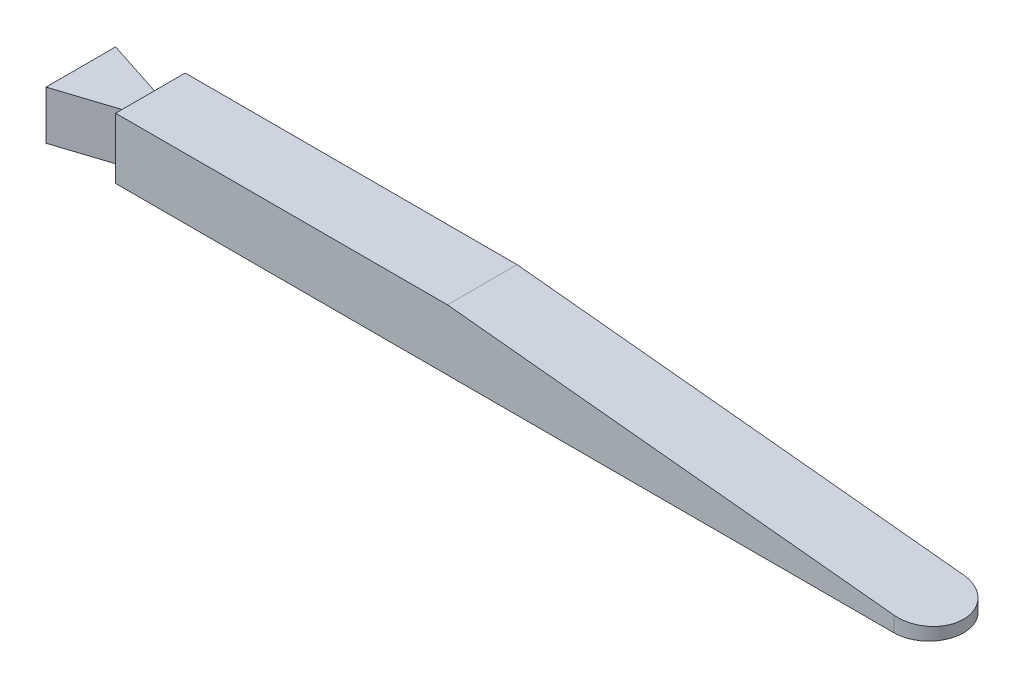
ISO-10303-21;
HEADER;
FILE_DESCRIPTION(('STEP AP214'),'2;1');
FILE_NAME('part.step','',(''),(''),'','','');
FILE_SCHEMA(('AUTOMOTIVE_DESIGN { 1 0 10303 214 1 1 1 1 }'));
ENDSEC;
DATA;
#1=APPLICATION_CONTEXT('core data for automotive mechanical design processes');
#2=APPLICATION_PROTOCOL_DEFINITION('international standard','automotive_design',2000,#1);
#3=PRODUCT_CONTEXT('',#1,'mechanical');
#4=PRODUCT('Part','Part','',(#3));
#5=PRODUCT_RELATED_PRODUCT_CATEGORY('part','',(#4));
#6=PRODUCT_DEFINITION_FORMATION('','',#4);
#7=PRODUCT_DEFINITION_CONTEXT('part definition',#1,'design');
#8=PRODUCT_DEFINITION('design','',#6,#7);
#9=PRODUCT_DEFINITION_SHAPE('','',#8);
#10=(LENGTH_UNIT() NAMED_UNIT(*) SI_UNIT(.MILLI.,.METRE.));
#11=(NAMED_UNIT(*) PLANE_ANGLE_UNIT() SI_UNIT($,.RADIAN.));
#12=(NAMED_UNIT(*) SI_UNIT($,.STERADIAN.) SOLID_ANGLE_UNIT());
#13=UNCERTAINTY_MEASURE_WITH_UNIT(LENGTH_MEASURE(1.E-05),#10,'distance_accuracy_value','');
#14=(GEOMETRIC_REPRESENTATION_CONTEXT(3) GLOBAL_UNCERTAINTY_ASSIGNED_CONTEXT((#13)) GLOBAL_UNIT_ASSIGNED_CONTEXT((#10,
#11,#12)) REPRESENTATION_CONTEXT('',''));
#15=CARTESIAN_POINT('',(0.,0.,0.));
#16=DIRECTION('',(0.,0.,1.));
#17=DIRECTION('',(1.,0.,0.));
#18=AXIS2_PLACEMENT_3D('',#15,#16,#17);
#19=CARTESIAN_POINT('',(-22.0395487991643,31.75,2.54000000000013));
#20=DIRECTION('',(-0.307897158123463,0.,0.951419644541511));
#21=DIRECTION('',(0.951419644541511,0.,0.307897158123463));
#22=AXIS2_PLACEMENT_3D('',#19,#20,#21);
#23=PLANE('',#22);
#24=DIRECTION('',(-0.951419644541511,0.,-0.307897158123463));
#25=VECTOR('',#24,1.);
#26=CARTESIAN_POINT('',(-22.0395487991643,25.4,2.54000000000014));
#27=LINE('',#26,#25);
#28=CARTESIAN_POINT('',(14.3002312008357,25.4,14.300231200843));
#29=VERTEX_POINT('',#28);
#30=CARTESIAN_POINT('',(-22.0395487991643,25.4,2.54000000000014));
#31=VERTEX_POINT('',#30);
#32=EDGE_CURVE('E221',#29,#31,#27,.T.);
#33=ORIENTED_EDGE('',*,*,#32,.F.);
#34=DIRECTION('',(0.,-1.,0.));
#35=VECTOR('',#34,1.);
#36=CARTESIAN_POINT('',(14.3002312008357,31.75,14.300231200843));
#37=LINE('',#36,#35);
#38=CARTESIAN_POINT('',(14.3002312008357,0.,14.300231200843));
#39=VERTEX_POINT('',#38);
#40=EDGE_CURVE('E12',#29,#39,#37,.T.);
#41=ORIENTED_EDGE('',*,*,#40,.T.);
#42=DIRECTION('',(-0.951419644541511,0.,-0.307897158123463));
#43=VECTOR('',#42,1.);
#44=CARTESIAN_POINT('',(-22.0395487991643,0.,2.54000000000013));
#45=LINE('',#44,#43);
#46=CARTESIAN_POINT('',(-22.0395487991643,0.,2.54000000000013));
#47=VERTEX_POINT('',#46);
#48=EDGE_CURVE('E126',#39,#47,#45,.T.);
#49=ORIENTED_EDGE('',*,*,#48,.T.);
#50=DIRECTION('',(0.,-1.,0.));
#51=VECTOR('',#50,1.);
#52=CARTESIAN_POINT('',(-22.0395487991643,31.75,2.54000000000013));
#53=LINE('',#52,#51);
#54=EDGE_CURVE('E55',#31,#47,#53,.T.);
#55=ORIENTED_EDGE('',*,*,#54,.F.);
#56=EDGE_LOOP('',(#33,#41,#49,#55));
#57=FACE_BOUND('',#56,.T.);
#58=ADVANCED_FACE('F47',(#57),#23,.F.);
#59=CARTESIAN_POINT('',(-22.0395487991643,31.75,2.54000000000013));
#60=DIRECTION('',(1.,0.,0.));
#61=DIRECTION('',(0.,0.,-1.));
#62=AXIS2_PLACEMENT_3D('',#59,#60,#61);
#63=PLANE('',#62);
#64=DIRECTION('',(0.,0.,1.));
#65=VECTOR('',#64,1.);
#66=CARTESIAN_POINT('',(-22.0395487991643,25.4,2.54000000000014));
#67=LINE('',#66,#65);
#68=CARTESIAN_POINT('',(-22.0395487991643,25.4,38.8797800000001));
#69=VERTEX_POINT('',#68);
#70=EDGE_CURVE('E179',#31,#69,#67,.T.);
#71=ORIENTED_EDGE('',*,*,#70,.F.);
#72=ORIENTED_EDGE('',*,*,#54,.T.);
#73=DIRECTION('',(0.,0.,1.));
#74=VECTOR('',#73,1.);
#75=CARTESIAN_POINT('',(-22.0395487991643,0.,2.54000000000013));
#76=LINE('',#75,#74);
#77=CARTESIAN_POINT('',(-22.0395487991643,0.,38.8797800000001));
#78=VERTEX_POINT('',#77);
#79=EDGE_CURVE('E132',#47,#78,#76,.T.);
#80=ORIENTED_EDGE('',*,*,#79,.T.);
#81=DIRECTION('',(0.,-1.,0.));
#82=VECTOR('',#81,1.);
#83=CARTESIAN_POINT('',(-22.0395487991643,31.75,38.8797800000001));
#84=LINE('',#83,#82);
#85=EDGE_CURVE('E168',#69,#78,#84,.T.);
#86=ORIENTED_EDGE('',*,*,#85,.F.);
#87=EDGE_LOOP('',(#71,#72,#80,#86));
#88=FACE_BOUND('',#87,.T.);
#89=ADVANCED_FACE('F174',(#88),#63,.F.);
#90=CARTESIAN_POINT('',(-22.0395487991643,31.75,38.8797800000001));
#91=DIRECTION('',(-0.307897158123464,0.,-0.951419644541511));
#92=DIRECTION('',(-0.951419644541511,0.,0.307897158123464));
#93=AXIS2_PLACEMENT_3D('',#90,#91,#92);
#94=PLANE('',#93);
#95=DIRECTION('',(0.951419644541511,0.,-0.307897158123464));
#96=VECTOR('',#95,1.);
#97=CARTESIAN_POINT('',(-22.0395487991643,25.4,38.8797800000001));
#98=LINE('',#97,#96);
#99=CARTESIAN_POINT('',(14.3002312008357,25.4,27.1195487991573));
#100=VERTEX_POINT('',#99);
#101=EDGE_CURVE('E191',#69,#100,#98,.T.);
#102=ORIENTED_EDGE('',*,*,#101,.F.);
#103=ORIENTED_EDGE('',*,*,#85,.T.);
#104=DIRECTION('',(0.951419644541511,0.,-0.307897158123464));
#105=VECTOR('',#104,1.);
#106=CARTESIAN_POINT('',(-22.0395487991643,0.,38.8797800000001));
#107=LINE('',#106,#105);
#108=CARTESIAN_POINT('',(14.3002312008357,0.,27.1195487991573));
#109=VERTEX_POINT('',#108);
#110=EDGE_CURVE('E143',#78,#109,#107,.T.);
#111=ORIENTED_EDGE('',*,*,#110,.T.);
#112=DIRECTION('',(0.,-1.,0.));
#113=VECTOR('',#112,1.);
#114=CARTESIAN_POINT('',(14.3002312008357,31.75,27.1195487991573));
#115=LINE('',#114,#113);
#116=EDGE_CURVE('E165',#100,#109,#115,.T.);
#117=ORIENTED_EDGE('',*,*,#116,.F.);
#118=EDGE_LOOP('',(#102,#103,#111,#117));
#119=FACE_BOUND('',#118,.T.);
#120=ADVANCED_FACE('F187',(#119),#94,.F.);
#121=CARTESIAN_POINT('',(14.3002312008357,31.75,27.1195487991573));
#122=DIRECTION('',(1.,0.,0.));
#123=DIRECTION('',(0.,0.,-1.));
#124=AXIS2_PLACEMENT_3D('',#121,#122,#123);
#125=PLANE('',#124);
#126=DIRECTION('',(0.,0.,1.));
#127=VECTOR('',#126,1.);
#128=CARTESIAN_POINT('',(14.3002312008357,0.,27.1195487991573));
#129=LINE('',#128,#127);
#130=CARTESIAN_POINT('',(14.3002312008357,0.,38.8797800000001));
#131=VERTEX_POINT('',#130);
#132=EDGE_CURVE('E147',#109,#131,#129,.T.);
#133=ORIENTED_EDGE('',*,*,#132,.T.);
#134=DIRECTION('',(0.,-1.,0.));
#135=VECTOR('',#134,1.);
#136=CARTESIAN_POINT('',(14.3002312008357,31.75,38.8797800000001));
#137=LINE('',#136,#135);
#138=CARTESIAN_POINT('',(14.3002312008357,31.75,38.8797800000001));
#139=VERTEX_POINT('',#138);
#140=EDGE_CURVE('E161',#139,#131,#137,.T.);
#141=ORIENTED_EDGE('',*,*,#140,.F.);
#142=DIRECTION('',(0.,0.,1.));
#143=VECTOR('',#142,1.);
#144=CARTESIAN_POINT('',(14.3002312008357,31.75,2.54000000000013));
#145=LINE('',#144,#143);
#146=CARTESIAN_POINT('',(14.3002312008357,31.75,2.54000000000013));
#147=VERTEX_POINT('',#146);
#148=EDGE_CURVE('E111',#147,#139,#145,.T.);
#149=ORIENTED_EDGE('',*,*,#148,.F.);
#150=DIRECTION('',(0.,-1.,0.));
#151=VECTOR('',#150,1.);
#152=CARTESIAN_POINT('',(14.3002312008357,31.75,2.54000000000013));
#153=LINE('',#152,#151);
#154=CARTESIAN_POINT('',(14.3002312008357,0.,2.54000000000013));
#155=VERTEX_POINT('',#154);
#156=EDGE_CURVE('E102',#147,#155,#153,.T.);
#157=ORIENTED_EDGE('',*,*,#156,.T.);
#158=DIRECTION('',(0.,0.,1.));
#159=VECTOR('',#158,1.);
#160=CARTESIAN_POINT('',(14.3002312008357,0.,2.54000000000013));
#161=LINE('',#160,#159);
#162=EDGE_CURVE('E118',#155,#39,#161,.T.);
#163=ORIENTED_EDGE('',*,*,#162,.T.);
#164=ORIENTED_EDGE('',*,*,#40,.F.);
#165=DIRECTION('',(0.,0.,-1.));
#166=VECTOR('',#165,1.);
#167=CARTESIAN_POINT('',(14.3002312008357,25.4,27.1195487991573));
#168=LINE('',#167,#166);
#169=EDGE_CURVE('E219',#100,#29,#168,.T.);
#170=ORIENTED_EDGE('',*,*,#169,.F.);
#171=ORIENTED_EDGE('',*,*,#116,.T.);
#172=EDGE_LOOP('',(#133,#141,#149,#157,#163,#164,#170,#171));
#173=FACE_BOUND('',#172,.T.);
#174=ADVANCED_FACE('F116',(#173),#125,.F.);
#175=CARTESIAN_POINT('',(14.3002312008357,31.75,38.8797800000001));
#176=DIRECTION('',(0.,0.,-1.));
#177=DIRECTION('',(-1.,0.,0.));
#178=AXIS2_PLACEMENT_3D('',#175,#176,#177);
#179=PLANE('',#178);
#180=DIRECTION('',(0.,-1.,0.));
#181=VECTOR('',#180,1.);
#182=CARTESIAN_POINT('',(420.689751691261,31.75,38.8797800000001));
#183=LINE('',#182,#181);
#184=CARTESIAN_POINT('',(420.689751691261,8.00221016740496,38.8797800000001));
#185=VERTEX_POINT('',#184);
#186=CARTESIAN_POINT('',(420.689751691261,0.,38.8797800000001));
#187=VERTEX_POINT('',#186);
#188=EDGE_CURVE('E158',#185,#187,#183,.T.);
#189=ORIENTED_EDGE('',*,*,#188,.F.);
#190=DIRECTION('',(0.994851192947797,-0.101346454749758,0.));
#191=VECTOR('',#190,1.);
#192=CARTESIAN_POINT('',(187.573387599727,31.75,38.8797800000001));
#193=LINE('',#192,#191);
#194=CARTESIAN_POINT('',(187.573387599727,31.75,38.8797800000001));
#195=VERTEX_POINT('',#194);
#196=EDGE_CURVE('E208',#195,#185,#193,.T.);
#197=ORIENTED_EDGE('',*,*,#196,.F.);
#198=DIRECTION('',(1.,0.,0.));
#199=VECTOR('',#198,1.);
#200=CARTESIAN_POINT('',(14.3002312008357,31.75,38.8797800000001));
#201=LINE('',#200,#199);
#202=EDGE_CURVE('E218',#139,#195,#201,.T.);
#203=ORIENTED_EDGE('',*,*,#202,.F.);
#204=ORIENTED_EDGE('',*,*,#140,.T.);
#205=DIRECTION('',(1.,0.,0.));
#206=VECTOR('',#205,1.);
#207=CARTESIAN_POINT('',(14.3002312008357,0.,38.8797800000001));
#208=LINE('',#207,#206);
#209=EDGE_CURVE('E150',#131,#187,#208,.T.);
#210=ORIENTED_EDGE('',*,*,#209,.T.);
#211=EDGE_LOOP('',(#189,#197,#203,#204,#210));
#212=FACE_BOUND('',#211,.T.);
#213=ADVANCED_FACE('F215',(#212),#179,.F.);
#214=CARTESIAN_POINT('',(420.689751691261,31.75,20.7098900000001));
#215=DIRECTION('',(0.,-1.,0.));
#216=DIRECTION('',(0.,0.,-1.));
#217=AXIS2_PLACEMENT_3D('',#214,#215,#216);
#218=CYLINDRICAL_SURFACE('',#217,18.16989);
#219=CARTESIAN_POINT('',(420.689751691261,8.00221016740496,20.7098900000001));
#220=DIRECTION('',(-0.101346454749758,-0.994851192947797,0.));
#221=DIRECTION('',(0.994851192947797,-0.101346454749758,0.));
#222=AXIS2_PLACEMENT_3D('',#219,#220,#221);
#223=ELLIPSE('',#222,18.2639274383957,18.16989);
#224=CARTESIAN_POINT('',(420.689751691261,8.00221016740496,2.54000000000013));
#225=VERTEX_POINT('',#224);
#226=EDGE_CURVE('E128',#225,#185,#223,.T.);
#227=ORIENTED_EDGE('',*,*,#226,.T.);
#228=ORIENTED_EDGE('',*,*,#188,.T.);
#229=CARTESIAN_POINT('',(420.689751691261,0.,20.7098900000001));
#230=DIRECTION('',(0.,1.,0.));
#231=DIRECTION('',(0.,0.,1.));
#232=AXIS2_PLACEMENT_3D('',#229,#230,#231);
#233=CIRCLE('',#232,18.16989);
#234=CARTESIAN_POINT('',(420.689751691261,0.,2.54000000000013));
#235=VERTEX_POINT('',#234);
#236=EDGE_CURVE('E112',#187,#235,#233,.T.);
#237=ORIENTED_EDGE('',*,*,#236,.T.);
#238=DIRECTION('',(0.,-1.,0.));
#239=VECTOR('',#238,1.);
#240=CARTESIAN_POINT('',(420.689751691261,31.75,2.54000000000013));
#241=LINE('',#240,#239);
#242=EDGE_CURVE('E105',#225,#235,#241,.T.);
#243=ORIENTED_EDGE('',*,*,#242,.F.);
#244=EDGE_LOOP('',(#227,#228,#237,#243));
#245=FACE_BOUND('',#244,.T.);
#246=ADVANCED_FACE('F213',(#245),#218,.T.);
#247=CARTESIAN_POINT('',(14.3002312008357,31.75,2.54000000000013));
#248=DIRECTION('',(0.,0.,1.));
#249=DIRECTION('',(1.,0.,0.));
#250=AXIS2_PLACEMENT_3D('',#247,#248,#249);
#251=PLANE('',#250);
#252=DIRECTION('',(-1.,0.,0.));
#253=VECTOR('',#252,1.);
#254=CARTESIAN_POINT('',(14.3002312008357,31.75,2.54000000000013));
#255=LINE('',#254,#253);
#256=CARTESIAN_POINT('',(187.573387599727,31.75,2.54000000000013));
#257=VERTEX_POINT('',#256);
#258=EDGE_CURVE('E70',#257,#147,#255,.T.);
#259=ORIENTED_EDGE('',*,*,#258,.F.);
#260=DIRECTION('',(0.994851192947797,-0.101346454749758,0.));
#261=VECTOR('',#260,1.);
#262=CARTESIAN_POINT('',(187.573387599727,31.75,2.54000000000013));
#263=LINE('',#262,#261);
#264=EDGE_CURVE('E62',#257,#225,#263,.T.);
#265=ORIENTED_EDGE('',*,*,#264,.T.);
#266=ORIENTED_EDGE('',*,*,#242,.T.);
#267=DIRECTION('',(-1.,0.,0.));
#268=VECTOR('',#267,1.);
#269=CARTESIAN_POINT('',(14.3002312008357,0.,2.54000000000013));
#270=LINE('',#269,#268);
#271=EDGE_CURVE('E99',#235,#155,#270,.T.);
#272=ORIENTED_EDGE('',*,*,#271,.T.);
#273=ORIENTED_EDGE('',*,*,#156,.F.);
#274=EDGE_LOOP('',(#259,#265,#266,#272,#273));
#275=FACE_BOUND('',#274,.T.);
#276=ADVANCED_FACE('F101',(#275),#251,.F.);
#277=CARTESIAN_POINT('',(420.689751691261,31.75,20.7098900000001));
#278=DIRECTION('',(0.,1.,0.));
#279=DIRECTION('',(0.,0.,1.));
#280=AXIS2_PLACEMENT_3D('',#277,#278,#279);
#281=PLANE('',#280);
#282=ORIENTED_EDGE('',*,*,#148,.T.);
#283=ORIENTED_EDGE('',*,*,#202,.T.);
#284=DIRECTION('',(0.,0.,1.));
#285=VECTOR('',#284,1.);
#286=CARTESIAN_POINT('',(187.573387599727,31.75,2.54000000000013));
#287=LINE('',#286,#285);
#288=EDGE_CURVE('E135',#257,#195,#287,.T.);
#289=ORIENTED_EDGE('',*,*,#288,.F.);
#290=ORIENTED_EDGE('',*,*,#258,.T.);
#291=EDGE_LOOP('',(#282,#283,#289,#290));
#292=FACE_BOUND('',#291,.T.);
#293=ADVANCED_FACE('F238',(#292),#281,.T.);
#294=CARTESIAN_POINT('',(420.689751691261,0.,20.7098900000001));
#295=DIRECTION('',(0.,1.,0.));
#296=DIRECTION('',(0.,0.,1.));
#297=AXIS2_PLACEMENT_3D('',#294,#295,#296);
#298=PLANE('',#297);
#299=ORIENTED_EDGE('',*,*,#162,.F.);
#300=ORIENTED_EDGE('',*,*,#271,.F.);
#301=ORIENTED_EDGE('',*,*,#236,.F.);
#302=ORIENTED_EDGE('',*,*,#209,.F.);
#303=ORIENTED_EDGE('',*,*,#132,.F.);
#304=ORIENTED_EDGE('',*,*,#110,.F.);
#305=ORIENTED_EDGE('',*,*,#79,.F.);
#306=ORIENTED_EDGE('',*,*,#48,.F.);
#307=EDGE_LOOP('',(#299,#300,#301,#302,#303,#304,#305,#306));
#308=FACE_BOUND('',#307,.T.);
#309=ADVANCED_FACE('F123',(#308),#298,.F.);
#310=CARTESIAN_POINT('',(187.573387599727,31.75,2.54000000000013));
#311=DIRECTION('',(-0.101346454749758,-0.994851192947797,0.));
#312=DIRECTION('',(0.994851192947797,-0.101346454749758,0.));
#313=AXIS2_PLACEMENT_3D('',#310,#311,#312);
#314=PLANE('',#313);
#315=ORIENTED_EDGE('',*,*,#226,.F.);
#316=ORIENTED_EDGE('',*,*,#264,.F.);
#317=ORIENTED_EDGE('',*,*,#288,.T.);
#318=ORIENTED_EDGE('',*,*,#196,.T.);
#319=EDGE_LOOP('',(#315,#316,#317,#318));
#320=FACE_BOUND('',#319,.T.);
#321=ADVANCED_FACE('F206',(#320),#314,.F.);
#322=CARTESIAN_POINT('',(0.,25.4,0.));
#323=DIRECTION('',(0.,1.,0.));
#324=DIRECTION('',(0.,0.,1.));
#325=AXIS2_PLACEMENT_3D('',#322,#323,#324);
#326=PLANE('',#325);
#327=ORIENTED_EDGE('',*,*,#70,.T.);
#328=ORIENTED_EDGE('',*,*,#101,.T.);
#329=ORIENTED_EDGE('',*,*,#169,.T.);
#330=ORIENTED_EDGE('',*,*,#32,.T.);
#331=EDGE_LOOP('',(#327,#328,#329,#330));
#332=FACE_BOUND('',#331,.T.);
#333=ADVANCED_FACE('F223',(#332),#326,.T.);
#334=CLOSED_SHELL('',(#58,#89,#120,#174,#213,#246,#276,#293,#309,#321,#333));
#335=MANIFOLD_SOLID_BREP('B2',#334);
#336=ADVANCED_BREP_SHAPE_REPRESENTATION('',(#18,#335),#14);
#337=SHAPE_DEFINITION_REPRESENTATION(#9,#336);
ENDSEC;
END-ISO-10303-21;
